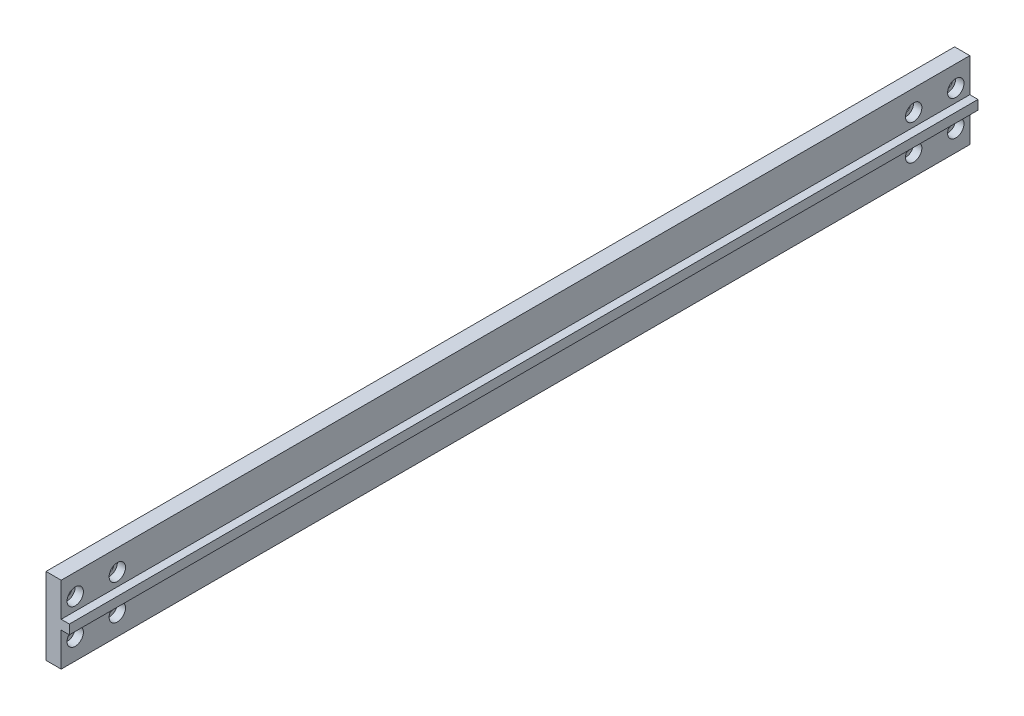
ISO-10303-21;
HEADER;
FILE_DESCRIPTION(('STEP AP214'),'2;1');
FILE_NAME('part.step','',(''),(''),'','','');
FILE_SCHEMA(('AUTOMOTIVE_DESIGN { 1 0 10303 214 1 1 1 1 }'));
ENDSEC;
DATA;
#1=APPLICATION_CONTEXT('core data for automotive mechanical design processes');
#2=APPLICATION_PROTOCOL_DEFINITION('international standard','automotive_design',2000,#1);
#3=PRODUCT_CONTEXT('',#1,'mechanical');
#4=PRODUCT('Part','Part','',(#3));
#5=PRODUCT_RELATED_PRODUCT_CATEGORY('part','',(#4));
#6=PRODUCT_DEFINITION_FORMATION('','',#4);
#7=PRODUCT_DEFINITION_CONTEXT('part definition',#1,'design');
#8=PRODUCT_DEFINITION('design','',#6,#7);
#9=PRODUCT_DEFINITION_SHAPE('','',#8);
#10=(LENGTH_UNIT() NAMED_UNIT(*) SI_UNIT(.MILLI.,.METRE.));
#11=(NAMED_UNIT(*) PLANE_ANGLE_UNIT() SI_UNIT($,.RADIAN.));
#12=(NAMED_UNIT(*) SI_UNIT($,.STERADIAN.) SOLID_ANGLE_UNIT());
#13=UNCERTAINTY_MEASURE_WITH_UNIT(LENGTH_MEASURE(1.E-05),#10,'distance_accuracy_value','');
#14=(GEOMETRIC_REPRESENTATION_CONTEXT(3) GLOBAL_UNCERTAINTY_ASSIGNED_CONTEXT((#13)) GLOBAL_UNIT_ASSIGNED_CONTEXT((#10,
#11,#12)) REPRESENTATION_CONTEXT('',''));
#15=CARTESIAN_POINT('',(0.,0.,0.));
#16=DIRECTION('',(0.,0.,1.));
#17=DIRECTION('',(1.,0.,0.));
#18=AXIS2_PLACEMENT_3D('',#15,#16,#17);
#19=CARTESIAN_POINT('',(0.,-16.475,388.6));
#20=DIRECTION('',(0.,1.,0.));
#21=DIRECTION('',(0.,0.,1.));
#22=AXIS2_PLACEMENT_3D('',#19,#20,#21);
#23=PLANE('',#22);
#24=DIRECTION('',(1.,0.,0.));
#25=VECTOR('',#24,1.);
#26=CARTESIAN_POINT('',(0.,-16.475,0.));
#27=LINE('',#26,#25);
#28=CARTESIAN_POINT('',(0.,-16.475,0.));
#29=VERTEX_POINT('',#28);
#30=CARTESIAN_POINT('',(6.5,-16.475,0.));
#31=VERTEX_POINT('',#30);
#32=EDGE_CURVE('E133',#29,#31,#27,.T.);
#33=ORIENTED_EDGE('',*,*,#32,.T.);
#34=DIRECTION('',(0.,0.,-1.));
#35=VECTOR('',#34,1.);
#36=CARTESIAN_POINT('',(6.5,-16.475,388.6));
#37=LINE('',#36,#35);
#38=CARTESIAN_POINT('',(6.5,-16.475,388.6));
#39=VERTEX_POINT('',#38);
#40=EDGE_CURVE('E11',#39,#31,#37,.T.);
#41=ORIENTED_EDGE('',*,*,#40,.F.);
#42=DIRECTION('',(1.,0.,0.));
#43=VECTOR('',#42,1.);
#44=CARTESIAN_POINT('',(0.,-16.475,388.6));
#45=LINE('',#44,#43);
#46=CARTESIAN_POINT('',(0.,-16.475,388.6));
#47=VERTEX_POINT('',#46);
#48=EDGE_CURVE('E148',#47,#39,#45,.T.);
#49=ORIENTED_EDGE('',*,*,#48,.F.);
#50=DIRECTION('',(0.,0.,-1.));
#51=VECTOR('',#50,1.);
#52=CARTESIAN_POINT('',(0.,-16.475,388.6));
#53=LINE('',#52,#51);
#54=EDGE_CURVE('E129',#47,#29,#53,.T.);
#55=ORIENTED_EDGE('',*,*,#54,.T.);
#56=EDGE_LOOP('',(#33,#41,#49,#55));
#57=FACE_BOUND('',#56,.T.);
#58=ADVANCED_FACE('F37',(#57),#23,.F.);
#59=CARTESIAN_POINT('',(6.5,-1.99999999999999,388.6));
#60=DIRECTION('',(-1.,0.,0.));
#61=DIRECTION('',(0.,-1.,0.));
#62=AXIS2_PLACEMENT_3D('',#59,#60,#61);
#63=PLANE('',#62);
#64=CARTESIAN_POINT('',(6.50000000000001,-7.5,382.6));
#65=DIRECTION('',(1.,0.,0.));
#66=DIRECTION('',(0.,0.,-1.));
#67=AXIS2_PLACEMENT_3D('',#64,#65,#66);
#68=CIRCLE('',#67,3.5);
#69=CARTESIAN_POINT('',(6.50000000000001,-7.5,379.1));
#70=VERTEX_POINT('',#69);
#71=EDGE_CURVE('E273',#70,#70,#68,.T.);
#72=ORIENTED_EDGE('',*,*,#71,.F.);
#73=EDGE_LOOP('',(#72));
#74=FACE_BOUND('',#73,.T.);
#75=CARTESIAN_POINT('',(6.50000000000001,-7.5,364.6));
#76=DIRECTION('',(1.,0.,0.));
#77=DIRECTION('',(0.,0.,-1.));
#78=AXIS2_PLACEMENT_3D('',#75,#76,#77);
#79=CIRCLE('',#78,3.5);
#80=CARTESIAN_POINT('',(6.50000000000001,-7.5,361.1));
#81=VERTEX_POINT('',#80);
#82=EDGE_CURVE('E261',#81,#81,#79,.T.);
#83=ORIENTED_EDGE('',*,*,#82,.F.);
#84=EDGE_LOOP('',(#83));
#85=FACE_BOUND('',#84,.T.);
#86=CARTESIAN_POINT('',(6.50000000000001,-7.5,24.));
#87=DIRECTION('',(1.,0.,0.));
#88=DIRECTION('',(0.,0.,-1.));
#89=AXIS2_PLACEMENT_3D('',#86,#87,#88);
#90=CIRCLE('',#89,3.5);
#91=CARTESIAN_POINT('',(6.50000000000001,-7.5,20.5));
#92=VERTEX_POINT('',#91);
#93=EDGE_CURVE('E213',#92,#92,#90,.T.);
#94=ORIENTED_EDGE('',*,*,#93,.F.);
#95=EDGE_LOOP('',(#94));
#96=FACE_BOUND('',#95,.T.);
#97=CARTESIAN_POINT('',(6.50000000000001,-7.5,6.00000000000001));
#98=DIRECTION('',(1.,0.,0.));
#99=DIRECTION('',(0.,0.,-1.));
#100=AXIS2_PLACEMENT_3D('',#97,#98,#99);
#101=CIRCLE('',#100,3.5);
#102=CARTESIAN_POINT('',(6.50000000000001,-7.5,2.50000000000001));
#103=VERTEX_POINT('',#102);
#104=EDGE_CURVE('E201',#103,#103,#101,.T.);
#105=ORIENTED_EDGE('',*,*,#104,.F.);
#106=EDGE_LOOP('',(#105));
#107=FACE_BOUND('',#106,.T.);
#108=DIRECTION('',(0.,1.,0.));
#109=VECTOR('',#108,1.);
#110=CARTESIAN_POINT('',(6.5,-1.99999999999999,0.));
#111=LINE('',#110,#109);
#112=CARTESIAN_POINT('',(6.5,-1.99999999999999,0.));
#113=VERTEX_POINT('',#112);
#114=EDGE_CURVE('E136',#31,#113,#111,.T.);
#115=ORIENTED_EDGE('',*,*,#114,.T.);
#116=DIRECTION('',(0.,0.,-1.));
#117=VECTOR('',#116,1.);
#118=CARTESIAN_POINT('',(6.5,-1.99999999999999,388.6));
#119=LINE('',#118,#117);
#120=CARTESIAN_POINT('',(6.5,-1.99999999999999,388.6));
#121=VERTEX_POINT('',#120);
#122=EDGE_CURVE('E45',#121,#113,#119,.T.);
#123=ORIENTED_EDGE('',*,*,#122,.F.);
#124=DIRECTION('',(0.,1.,0.));
#125=VECTOR('',#124,1.);
#126=CARTESIAN_POINT('',(6.5,-1.99999999999999,388.6));
#127=LINE('',#126,#125);
#128=EDGE_CURVE('E96',#39,#121,#127,.T.);
#129=ORIENTED_EDGE('',*,*,#128,.F.);
#130=ORIENTED_EDGE('',*,*,#40,.T.);
#131=EDGE_LOOP('',(#115,#123,#129,#130));
#132=FACE_BOUND('',#131,.T.);
#133=ADVANCED_FACE('F279',(#74,#85,#96,#107,#132),#63,.F.);
#134=CARTESIAN_POINT('',(10.,-1.99999999999999,388.6));
#135=DIRECTION('',(0.,1.,0.));
#136=DIRECTION('',(-1.,0.,0.));
#137=AXIS2_PLACEMENT_3D('',#134,#135,#136);
#138=PLANE('',#137);
#139=DIRECTION('',(1.,0.,0.));
#140=VECTOR('',#139,1.);
#141=CARTESIAN_POINT('',(10.,-1.99999999999999,0.));
#142=LINE('',#141,#140);
#143=CARTESIAN_POINT('',(10.,-1.99999999999999,0.));
#144=VERTEX_POINT('',#143);
#145=EDGE_CURVE('E139',#113,#144,#142,.T.);
#146=ORIENTED_EDGE('',*,*,#145,.T.);
#147=DIRECTION('',(0.,0.,-1.));
#148=VECTOR('',#147,1.);
#149=CARTESIAN_POINT('',(10.,-1.99999999999999,388.6));
#150=LINE('',#149,#148);
#151=CARTESIAN_POINT('',(10.,-1.99999999999999,388.6));
#152=VERTEX_POINT('',#151);
#153=EDGE_CURVE('E155',#152,#144,#150,.T.);
#154=ORIENTED_EDGE('',*,*,#153,.F.);
#155=DIRECTION('',(1.,0.,0.));
#156=VECTOR('',#155,1.);
#157=CARTESIAN_POINT('',(10.,-1.99999999999999,388.6));
#158=LINE('',#157,#156);
#159=EDGE_CURVE('E163',#121,#152,#158,.T.);
#160=ORIENTED_EDGE('',*,*,#159,.F.);
#161=ORIENTED_EDGE('',*,*,#122,.T.);
#162=EDGE_LOOP('',(#146,#154,#160,#161));
#163=FACE_BOUND('',#162,.T.);
#164=ADVANCED_FACE('F161',(#163),#138,.F.);
#165=CARTESIAN_POINT('',(10.,2.00000000000001,388.6));
#166=DIRECTION('',(-1.,0.,0.));
#167=DIRECTION('',(0.,0.,1.));
#168=AXIS2_PLACEMENT_3D('',#165,#166,#167);
#169=PLANE('',#168);
#170=DIRECTION('',(0.,1.,0.));
#171=VECTOR('',#170,1.);
#172=CARTESIAN_POINT('',(10.,2.00000000000001,0.));
#173=LINE('',#172,#171);
#174=CARTESIAN_POINT('',(10.,2.00000000000001,0.));
#175=VERTEX_POINT('',#174);
#176=EDGE_CURVE('E141',#144,#175,#173,.T.);
#177=ORIENTED_EDGE('',*,*,#176,.T.);
#178=DIRECTION('',(0.,0.,-1.));
#179=VECTOR('',#178,1.);
#180=CARTESIAN_POINT('',(10.,2.00000000000001,388.6));
#181=LINE('',#180,#179);
#182=CARTESIAN_POINT('',(10.,2.00000000000001,388.6));
#183=VERTEX_POINT('',#182);
#184=EDGE_CURVE('E152',#183,#175,#181,.T.);
#185=ORIENTED_EDGE('',*,*,#184,.F.);
#186=DIRECTION('',(0.,1.,0.));
#187=VECTOR('',#186,1.);
#188=CARTESIAN_POINT('',(10.,2.00000000000001,388.6));
#189=LINE('',#188,#187);
#190=EDGE_CURVE('E175',#152,#183,#189,.T.);
#191=ORIENTED_EDGE('',*,*,#190,.F.);
#192=ORIENTED_EDGE('',*,*,#153,.T.);
#193=EDGE_LOOP('',(#177,#185,#191,#192));
#194=FACE_BOUND('',#193,.T.);
#195=ADVANCED_FACE('F171',(#194),#169,.F.);
#196=CARTESIAN_POINT('',(6.5,2.00000000000001,388.6));
#197=DIRECTION('',(0.,-1.,0.));
#198=DIRECTION('',(0.,0.,-1.));
#199=AXIS2_PLACEMENT_3D('',#196,#197,#198);
#200=PLANE('',#199);
#201=DIRECTION('',(-1.,0.,0.));
#202=VECTOR('',#201,1.);
#203=CARTESIAN_POINT('',(6.5,2.00000000000001,0.));
#204=LINE('',#203,#202);
#205=CARTESIAN_POINT('',(6.5,2.00000000000001,0.));
#206=VERTEX_POINT('',#205);
#207=EDGE_CURVE('E143',#175,#206,#204,.T.);
#208=ORIENTED_EDGE('',*,*,#207,.T.);
#209=DIRECTION('',(0.,0.,-1.));
#210=VECTOR('',#209,1.);
#211=CARTESIAN_POINT('',(6.5,2.00000000000001,388.6));
#212=LINE('',#211,#210);
#213=CARTESIAN_POINT('',(6.5,2.00000000000001,388.6));
#214=VERTEX_POINT('',#213);
#215=EDGE_CURVE('E124',#214,#206,#212,.T.);
#216=ORIENTED_EDGE('',*,*,#215,.F.);
#217=DIRECTION('',(-1.,0.,0.));
#218=VECTOR('',#217,1.);
#219=CARTESIAN_POINT('',(6.5,2.00000000000001,388.6));
#220=LINE('',#219,#218);
#221=EDGE_CURVE('E115',#183,#214,#220,.T.);
#222=ORIENTED_EDGE('',*,*,#221,.F.);
#223=ORIENTED_EDGE('',*,*,#184,.T.);
#224=EDGE_LOOP('',(#208,#216,#222,#223));
#225=FACE_BOUND('',#224,.T.);
#226=ADVANCED_FACE('F174',(#225),#200,.F.);
#227=CARTESIAN_POINT('',(6.49999999999999,16.475,388.6));
#228=DIRECTION('',(-1.,0.,0.));
#229=DIRECTION('',(0.,-1.,0.));
#230=AXIS2_PLACEMENT_3D('',#227,#228,#229);
#231=PLANE('',#230);
#232=CARTESIAN_POINT('',(6.5,7.5,364.6));
#233=DIRECTION('',(1.,0.,0.));
#234=DIRECTION('',(0.,0.,-1.));
#235=AXIS2_PLACEMENT_3D('',#232,#233,#234);
#236=CIRCLE('',#235,3.5);
#237=CARTESIAN_POINT('',(6.5,7.5,361.1));
#238=VERTEX_POINT('',#237);
#239=EDGE_CURVE('E249',#238,#238,#236,.T.);
#240=ORIENTED_EDGE('',*,*,#239,.F.);
#241=EDGE_LOOP('',(#240));
#242=FACE_BOUND('',#241,.T.);
#243=CARTESIAN_POINT('',(6.5,7.5,382.6));
#244=DIRECTION('',(1.,0.,0.));
#245=DIRECTION('',(0.,0.,-1.));
#246=AXIS2_PLACEMENT_3D('',#243,#244,#245);
#247=CIRCLE('',#246,3.5);
#248=CARTESIAN_POINT('',(6.5,7.5,379.1));
#249=VERTEX_POINT('',#248);
#250=EDGE_CURVE('E237',#249,#249,#247,.T.);
#251=ORIENTED_EDGE('',*,*,#250,.F.);
#252=EDGE_LOOP('',(#251));
#253=FACE_BOUND('',#252,.T.);
#254=CARTESIAN_POINT('',(6.5,7.5,24.));
#255=DIRECTION('',(1.,0.,0.));
#256=DIRECTION('',(0.,0.,-1.));
#257=AXIS2_PLACEMENT_3D('',#254,#255,#256);
#258=CIRCLE('',#257,3.5);
#259=CARTESIAN_POINT('',(6.5,7.5,20.5));
#260=VERTEX_POINT('',#259);
#261=EDGE_CURVE('E225',#260,#260,#258,.T.);
#262=ORIENTED_EDGE('',*,*,#261,.F.);
#263=EDGE_LOOP('',(#262));
#264=FACE_BOUND('',#263,.T.);
#265=CARTESIAN_POINT('',(6.5,7.5,6.));
#266=DIRECTION('',(1.,0.,0.));
#267=DIRECTION('',(0.,0.,-1.));
#268=AXIS2_PLACEMENT_3D('',#265,#266,#267);
#269=CIRCLE('',#268,3.5);
#270=CARTESIAN_POINT('',(6.5,7.5,2.5));
#271=VERTEX_POINT('',#270);
#272=EDGE_CURVE('E189',#271,#271,#269,.T.);
#273=ORIENTED_EDGE('',*,*,#272,.F.);
#274=EDGE_LOOP('',(#273));
#275=FACE_BOUND('',#274,.T.);
#276=DIRECTION('',(0.,1.,0.));
#277=VECTOR('',#276,1.);
#278=CARTESIAN_POINT('',(6.49999999999999,16.475,0.));
#279=LINE('',#278,#277);
#280=CARTESIAN_POINT('',(6.49999999999999,16.475,0.));
#281=VERTEX_POINT('',#280);
#282=EDGE_CURVE('E123',#206,#281,#279,.T.);
#283=ORIENTED_EDGE('',*,*,#282,.T.);
#284=DIRECTION('',(0.,0.,-1.));
#285=VECTOR('',#284,1.);
#286=CARTESIAN_POINT('',(6.49999999999999,16.475,388.6));
#287=LINE('',#286,#285);
#288=CARTESIAN_POINT('',(6.49999999999999,16.475,388.6));
#289=VERTEX_POINT('',#288);
#290=EDGE_CURVE('E120',#289,#281,#287,.T.);
#291=ORIENTED_EDGE('',*,*,#290,.F.);
#292=DIRECTION('',(0.,1.,0.));
#293=VECTOR('',#292,1.);
#294=CARTESIAN_POINT('',(6.49999999999999,16.475,388.6));
#295=LINE('',#294,#293);
#296=EDGE_CURVE('E109',#214,#289,#295,.T.);
#297=ORIENTED_EDGE('',*,*,#296,.F.);
#298=ORIENTED_EDGE('',*,*,#215,.T.);
#299=EDGE_LOOP('',(#283,#291,#297,#298));
#300=FACE_BOUND('',#299,.T.);
#301=ADVANCED_FACE('F121',(#242,#253,#264,#275,#300),#231,.F.);
#302=CARTESIAN_POINT('',(0.,16.475,388.6));
#303=DIRECTION('',(0.,-1.,0.));
#304=DIRECTION('',(1.,0.,0.));
#305=AXIS2_PLACEMENT_3D('',#302,#303,#304);
#306=PLANE('',#305);
#307=DIRECTION('',(-1.,0.,0.));
#308=VECTOR('',#307,1.);
#309=CARTESIAN_POINT('',(0.,16.475,0.));
#310=LINE('',#309,#308);
#311=CARTESIAN_POINT('',(0.,16.475,0.));
#312=VERTEX_POINT('',#311);
#313=EDGE_CURVE('E82',#281,#312,#310,.T.);
#314=ORIENTED_EDGE('',*,*,#313,.T.);
#315=DIRECTION('',(0.,0.,-1.));
#316=VECTOR('',#315,1.);
#317=CARTESIAN_POINT('',(0.,16.475,388.6));
#318=LINE('',#317,#316);
#319=CARTESIAN_POINT('',(0.,16.475,388.6));
#320=VERTEX_POINT('',#319);
#321=EDGE_CURVE('E125',#320,#312,#318,.T.);
#322=ORIENTED_EDGE('',*,*,#321,.F.);
#323=DIRECTION('',(-1.,0.,0.));
#324=VECTOR('',#323,1.);
#325=CARTESIAN_POINT('',(0.,16.475,388.6));
#326=LINE('',#325,#324);
#327=EDGE_CURVE('E113',#289,#320,#326,.T.);
#328=ORIENTED_EDGE('',*,*,#327,.F.);
#329=ORIENTED_EDGE('',*,*,#290,.T.);
#330=EDGE_LOOP('',(#314,#322,#328,#329));
#331=FACE_BOUND('',#330,.T.);
#332=ADVANCED_FACE('F127',(#331),#306,.F.);
#333=CARTESIAN_POINT('',(0.,16.475,388.6));
#334=DIRECTION('',(1.,0.,0.));
#335=DIRECTION('',(0.,1.,0.));
#336=AXIS2_PLACEMENT_3D('',#333,#334,#335);
#337=PLANE('',#336);
#338=CARTESIAN_POINT('',(0.,-7.5,382.6));
#339=DIRECTION('',(1.,0.,0.));
#340=DIRECTION('',(0.,0.,-1.));
#341=AXIS2_PLACEMENT_3D('',#338,#339,#340);
#342=CIRCLE('',#341,2.);
#343=CARTESIAN_POINT('',(0.,-7.5,380.6));
#344=VERTEX_POINT('',#343);
#345=EDGE_CURVE('E264',#344,#344,#342,.T.);
#346=ORIENTED_EDGE('',*,*,#345,.T.);
#347=EDGE_LOOP('',(#346));
#348=FACE_BOUND('',#347,.T.);
#349=CARTESIAN_POINT('',(0.,-7.5,364.6));
#350=DIRECTION('',(1.,0.,0.));
#351=DIRECTION('',(0.,0.,-1.));
#352=AXIS2_PLACEMENT_3D('',#349,#350,#351);
#353=CIRCLE('',#352,2.);
#354=CARTESIAN_POINT('',(0.,-7.5,362.6));
#355=VERTEX_POINT('',#354);
#356=EDGE_CURVE('E252',#355,#355,#353,.T.);
#357=ORIENTED_EDGE('',*,*,#356,.T.);
#358=EDGE_LOOP('',(#357));
#359=FACE_BOUND('',#358,.T.);
#360=CARTESIAN_POINT('',(0.,7.5,364.6));
#361=DIRECTION('',(1.,0.,0.));
#362=DIRECTION('',(0.,0.,-1.));
#363=AXIS2_PLACEMENT_3D('',#360,#361,#362);
#364=CIRCLE('',#363,2.);
#365=CARTESIAN_POINT('',(0.,7.5,362.6));
#366=VERTEX_POINT('',#365);
#367=EDGE_CURVE('E240',#366,#366,#364,.T.);
#368=ORIENTED_EDGE('',*,*,#367,.T.);
#369=EDGE_LOOP('',(#368));
#370=FACE_BOUND('',#369,.T.);
#371=CARTESIAN_POINT('',(0.,7.5,382.6));
#372=DIRECTION('',(1.,0.,0.));
#373=DIRECTION('',(0.,0.,-1.));
#374=AXIS2_PLACEMENT_3D('',#371,#372,#373);
#375=CIRCLE('',#374,2.);
#376=CARTESIAN_POINT('',(0.,7.5,380.6));
#377=VERTEX_POINT('',#376);
#378=EDGE_CURVE('E228',#377,#377,#375,.T.);
#379=ORIENTED_EDGE('',*,*,#378,.T.);
#380=EDGE_LOOP('',(#379));
#381=FACE_BOUND('',#380,.T.);
#382=CARTESIAN_POINT('',(0.,7.5,24.));
#383=DIRECTION('',(1.,0.,0.));
#384=DIRECTION('',(0.,0.,-1.));
#385=AXIS2_PLACEMENT_3D('',#382,#383,#384);
#386=CIRCLE('',#385,2.);
#387=CARTESIAN_POINT('',(0.,7.5,22.));
#388=VERTEX_POINT('',#387);
#389=EDGE_CURVE('E216',#388,#388,#386,.T.);
#390=ORIENTED_EDGE('',*,*,#389,.T.);
#391=EDGE_LOOP('',(#390));
#392=FACE_BOUND('',#391,.T.);
#393=CARTESIAN_POINT('',(0.,-7.5,24.));
#394=DIRECTION('',(1.,0.,0.));
#395=DIRECTION('',(0.,0.,-1.));
#396=AXIS2_PLACEMENT_3D('',#393,#394,#395);
#397=CIRCLE('',#396,2.);
#398=CARTESIAN_POINT('',(0.,-7.5,22.));
#399=VERTEX_POINT('',#398);
#400=EDGE_CURVE('E204',#399,#399,#397,.T.);
#401=ORIENTED_EDGE('',*,*,#400,.T.);
#402=EDGE_LOOP('',(#401));
#403=FACE_BOUND('',#402,.T.);
#404=CARTESIAN_POINT('',(0.,-7.5,6.00000000000001));
#405=DIRECTION('',(1.,0.,0.));
#406=DIRECTION('',(0.,0.,-1.));
#407=AXIS2_PLACEMENT_3D('',#404,#405,#406);
#408=CIRCLE('',#407,2.);
#409=CARTESIAN_POINT('',(0.,-7.5,4.00000000000001));
#410=VERTEX_POINT('',#409);
#411=EDGE_CURVE('E192',#410,#410,#408,.T.);
#412=ORIENTED_EDGE('',*,*,#411,.T.);
#413=EDGE_LOOP('',(#412));
#414=FACE_BOUND('',#413,.T.);
#415=CARTESIAN_POINT('',(0.,7.5,6.));
#416=DIRECTION('',(1.,0.,0.));
#417=DIRECTION('',(0.,0.,-1.));
#418=AXIS2_PLACEMENT_3D('',#415,#416,#417);
#419=CIRCLE('',#418,2.);
#420=CARTESIAN_POINT('',(0.,7.5,4.));
#421=VERTEX_POINT('',#420);
#422=EDGE_CURVE('E137',#421,#421,#419,.T.);
#423=ORIENTED_EDGE('',*,*,#422,.T.);
#424=EDGE_LOOP('',(#423));
#425=FACE_BOUND('',#424,.T.);
#426=DIRECTION('',(0.,-1.,0.));
#427=VECTOR('',#426,1.);
#428=CARTESIAN_POINT('',(0.,16.475,0.));
#429=LINE('',#428,#427);
#430=EDGE_CURVE('E88',#312,#29,#429,.T.);
#431=ORIENTED_EDGE('',*,*,#430,.T.);
#432=ORIENTED_EDGE('',*,*,#54,.F.);
#433=DIRECTION('',(0.,-1.,0.));
#434=VECTOR('',#433,1.);
#435=CARTESIAN_POINT('',(0.,16.475,388.6));
#436=LINE('',#435,#434);
#437=EDGE_CURVE('E53',#320,#47,#436,.T.);
#438=ORIENTED_EDGE('',*,*,#437,.F.);
#439=ORIENTED_EDGE('',*,*,#321,.T.);
#440=EDGE_LOOP('',(#431,#432,#438,#439));
#441=FACE_BOUND('',#440,.T.);
#442=ADVANCED_FACE('F290',(#348,#359,#370,#381,#392,#403,#414,#425,#441),#337,.F.);
#443=CARTESIAN_POINT('',(0.,0.,388.6));
#444=DIRECTION('',(0.,0.,-1.));
#445=DIRECTION('',(-1.,0.,0.));
#446=AXIS2_PLACEMENT_3D('',#443,#444,#445);
#447=PLANE('',#446);
#448=ORIENTED_EDGE('',*,*,#48,.T.);
#449=ORIENTED_EDGE('',*,*,#128,.T.);
#450=ORIENTED_EDGE('',*,*,#159,.T.);
#451=ORIENTED_EDGE('',*,*,#190,.T.);
#452=ORIENTED_EDGE('',*,*,#221,.T.);
#453=ORIENTED_EDGE('',*,*,#296,.T.);
#454=ORIENTED_EDGE('',*,*,#327,.T.);
#455=ORIENTED_EDGE('',*,*,#437,.T.);
#456=EDGE_LOOP('',(#448,#449,#450,#451,#452,#453,#454,#455));
#457=FACE_BOUND('',#456,.T.);
#458=ADVANCED_FACE('F111',(#457),#447,.F.);
#459=CARTESIAN_POINT('',(0.,0.,0.));
#460=DIRECTION('',(0.,0.,-1.));
#461=DIRECTION('',(-1.,0.,0.));
#462=AXIS2_PLACEMENT_3D('',#459,#460,#461);
#463=PLANE('',#462);
#464=ORIENTED_EDGE('',*,*,#32,.F.);
#465=ORIENTED_EDGE('',*,*,#430,.F.);
#466=ORIENTED_EDGE('',*,*,#313,.F.);
#467=ORIENTED_EDGE('',*,*,#282,.F.);
#468=ORIENTED_EDGE('',*,*,#207,.F.);
#469=ORIENTED_EDGE('',*,*,#176,.F.);
#470=ORIENTED_EDGE('',*,*,#145,.F.);
#471=ORIENTED_EDGE('',*,*,#114,.F.);
#472=EDGE_LOOP('',(#464,#465,#466,#467,#468,#469,#470,#471));
#473=FACE_BOUND('',#472,.T.);
#474=ADVANCED_FACE('F167',(#473),#463,.T.);
#475=CARTESIAN_POINT('',(6.5,7.5,6.));
#476=DIRECTION('',(1.,0.,0.));
#477=DIRECTION('',(0.,0.,-1.));
#478=AXIS2_PLACEMENT_3D('',#475,#476,#477);
#479=CYLINDRICAL_SURFACE('',#478,2.);
#480=ORIENTED_EDGE('',*,*,#422,.F.);
#481=EDGE_LOOP('',(#480));
#482=FACE_BOUND('',#481,.T.);
#483=CARTESIAN_POINT('',(3.,7.5,6.));
#484=DIRECTION('',(1.,0.,0.));
#485=DIRECTION('',(0.,0.,-1.));
#486=AXIS2_PLACEMENT_3D('',#483,#484,#485);
#487=CIRCLE('',#486,2.);
#488=CARTESIAN_POINT('',(3.,7.5,4.));
#489=VERTEX_POINT('',#488);
#490=EDGE_CURVE('E183',#489,#489,#487,.T.);
#491=ORIENTED_EDGE('',*,*,#490,.T.);
#492=EDGE_LOOP('',(#491));
#493=FACE_BOUND('',#492,.T.);
#494=ADVANCED_FACE('F353',(#482,#493),#479,.F.);
#495=CARTESIAN_POINT('',(3.,9.5,6.));
#496=DIRECTION('',(-1.,0.,0.));
#497=DIRECTION('',(0.,0.,1.));
#498=AXIS2_PLACEMENT_3D('',#495,#496,#497);
#499=PLANE('',#498);
#500=ORIENTED_EDGE('',*,*,#490,.F.);
#501=EDGE_LOOP('',(#500));
#502=FACE_BOUND('',#501,.T.);
#503=CARTESIAN_POINT('',(3.,7.5,6.));
#504=DIRECTION('',(1.,0.,0.));
#505=DIRECTION('',(0.,0.,-1.));
#506=AXIS2_PLACEMENT_3D('',#503,#504,#505);
#507=CIRCLE('',#506,3.5);
#508=CARTESIAN_POINT('',(3.,7.5,2.5));
#509=VERTEX_POINT('',#508);
#510=EDGE_CURVE('E186',#509,#509,#507,.T.);
#511=ORIENTED_EDGE('',*,*,#510,.T.);
#512=EDGE_LOOP('',(#511));
#513=FACE_BOUND('',#512,.T.);
#514=ADVANCED_FACE('F362',(#502,#513),#499,.F.);
#515=CARTESIAN_POINT('',(6.5,7.5,6.));
#516=DIRECTION('',(1.,0.,0.));
#517=DIRECTION('',(0.,0.,-1.));
#518=AXIS2_PLACEMENT_3D('',#515,#516,#517);
#519=CYLINDRICAL_SURFACE('',#518,3.5);
#520=ORIENTED_EDGE('',*,*,#510,.F.);
#521=EDGE_LOOP('',(#520));
#522=FACE_BOUND('',#521,.T.);
#523=ORIENTED_EDGE('',*,*,#272,.T.);
#524=EDGE_LOOP('',(#523));
#525=FACE_BOUND('',#524,.T.);
#526=ADVANCED_FACE('F369',(#522,#525),#519,.F.);
#527=CARTESIAN_POINT('',(6.50000000000001,-7.5,6.00000000000001));
#528=DIRECTION('',(1.,0.,0.));
#529=DIRECTION('',(0.,0.,-1.));
#530=AXIS2_PLACEMENT_3D('',#527,#528,#529);
#531=CYLINDRICAL_SURFACE('',#530,2.);
#532=ORIENTED_EDGE('',*,*,#411,.F.);
#533=EDGE_LOOP('',(#532));
#534=FACE_BOUND('',#533,.T.);
#535=CARTESIAN_POINT('',(3.00000000000001,-7.5,6.00000000000001));
#536=DIRECTION('',(1.,0.,0.));
#537=DIRECTION('',(0.,0.,-1.));
#538=AXIS2_PLACEMENT_3D('',#535,#536,#537);
#539=CIRCLE('',#538,2.);
#540=CARTESIAN_POINT('',(3.00000000000001,-7.5,4.00000000000001));
#541=VERTEX_POINT('',#540);
#542=EDGE_CURVE('E195',#541,#541,#539,.T.);
#543=ORIENTED_EDGE('',*,*,#542,.T.);
#544=EDGE_LOOP('',(#543));
#545=FACE_BOUND('',#544,.T.);
#546=ADVANCED_FACE('F377',(#534,#545),#531,.F.);
#547=CARTESIAN_POINT('',(3.00000000000001,-5.5,6.00000000000001));
#548=DIRECTION('',(-1.,0.,0.));
#549=DIRECTION('',(0.,0.,1.));
#550=AXIS2_PLACEMENT_3D('',#547,#548,#549);
#551=PLANE('',#550);
#552=ORIENTED_EDGE('',*,*,#542,.F.);
#553=EDGE_LOOP('',(#552));
#554=FACE_BOUND('',#553,.T.);
#555=CARTESIAN_POINT('',(3.00000000000001,-7.5,6.00000000000001));
#556=DIRECTION('',(1.,0.,0.));
#557=DIRECTION('',(0.,0.,-1.));
#558=AXIS2_PLACEMENT_3D('',#555,#556,#557);
#559=CIRCLE('',#558,3.5);
#560=CARTESIAN_POINT('',(3.00000000000001,-7.5,2.50000000000001));
#561=VERTEX_POINT('',#560);
#562=EDGE_CURVE('E198',#561,#561,#559,.T.);
#563=ORIENTED_EDGE('',*,*,#562,.T.);
#564=EDGE_LOOP('',(#563));
#565=FACE_BOUND('',#564,.T.);
#566=ADVANCED_FACE('F385',(#554,#565),#551,.F.);
#567=CARTESIAN_POINT('',(6.50000000000001,-7.5,6.00000000000001));
#568=DIRECTION('',(1.,0.,0.));
#569=DIRECTION('',(0.,0.,-1.));
#570=AXIS2_PLACEMENT_3D('',#567,#568,#569);
#571=CYLINDRICAL_SURFACE('',#570,3.5);
#572=ORIENTED_EDGE('',*,*,#562,.F.);
#573=EDGE_LOOP('',(#572));
#574=FACE_BOUND('',#573,.T.);
#575=ORIENTED_EDGE('',*,*,#104,.T.);
#576=EDGE_LOOP('',(#575));
#577=FACE_BOUND('',#576,.T.);
#578=ADVANCED_FACE('F393',(#574,#577),#571,.F.);
#579=CARTESIAN_POINT('',(6.50000000000001,-7.5,24.));
#580=DIRECTION('',(1.,0.,0.));
#581=DIRECTION('',(0.,0.,-1.));
#582=AXIS2_PLACEMENT_3D('',#579,#580,#581);
#583=CYLINDRICAL_SURFACE('',#582,2.);
#584=ORIENTED_EDGE('',*,*,#400,.F.);
#585=EDGE_LOOP('',(#584));
#586=FACE_BOUND('',#585,.T.);
#587=CARTESIAN_POINT('',(3.00000000000001,-7.5,24.));
#588=DIRECTION('',(1.,0.,0.));
#589=DIRECTION('',(0.,0.,-1.));
#590=AXIS2_PLACEMENT_3D('',#587,#588,#589);
#591=CIRCLE('',#590,2.);
#592=CARTESIAN_POINT('',(3.00000000000001,-7.5,22.));
#593=VERTEX_POINT('',#592);
#594=EDGE_CURVE('E207',#593,#593,#591,.T.);
#595=ORIENTED_EDGE('',*,*,#594,.T.);
#596=EDGE_LOOP('',(#595));
#597=FACE_BOUND('',#596,.T.);
#598=ADVANCED_FACE('F401',(#586,#597),#583,.F.);
#599=CARTESIAN_POINT('',(3.00000000000001,-5.5,24.));
#600=DIRECTION('',(-1.,0.,0.));
#601=DIRECTION('',(0.,0.,1.));
#602=AXIS2_PLACEMENT_3D('',#599,#600,#601);
#603=PLANE('',#602);
#604=ORIENTED_EDGE('',*,*,#594,.F.);
#605=EDGE_LOOP('',(#604));
#606=FACE_BOUND('',#605,.T.);
#607=CARTESIAN_POINT('',(3.00000000000001,-7.5,24.));
#608=DIRECTION('',(1.,0.,0.));
#609=DIRECTION('',(0.,0.,-1.));
#610=AXIS2_PLACEMENT_3D('',#607,#608,#609);
#611=CIRCLE('',#610,3.5);
#612=CARTESIAN_POINT('',(3.00000000000001,-7.5,20.5));
#613=VERTEX_POINT('',#612);
#614=EDGE_CURVE('E210',#613,#613,#611,.T.);
#615=ORIENTED_EDGE('',*,*,#614,.T.);
#616=EDGE_LOOP('',(#615));
#617=FACE_BOUND('',#616,.T.);
#618=ADVANCED_FACE('F409',(#606,#617),#603,.F.);
#619=CARTESIAN_POINT('',(6.50000000000001,-7.5,24.));
#620=DIRECTION('',(1.,0.,0.));
#621=DIRECTION('',(0.,0.,-1.));
#622=AXIS2_PLACEMENT_3D('',#619,#620,#621);
#623=CYLINDRICAL_SURFACE('',#622,3.5);
#624=ORIENTED_EDGE('',*,*,#614,.F.);
#625=EDGE_LOOP('',(#624));
#626=FACE_BOUND('',#625,.T.);
#627=ORIENTED_EDGE('',*,*,#93,.T.);
#628=EDGE_LOOP('',(#627));
#629=FACE_BOUND('',#628,.T.);
#630=ADVANCED_FACE('F417',(#626,#629),#623,.F.);
#631=CARTESIAN_POINT('',(6.5,7.5,24.));
#632=DIRECTION('',(1.,0.,0.));
#633=DIRECTION('',(0.,0.,-1.));
#634=AXIS2_PLACEMENT_3D('',#631,#632,#633);
#635=CYLINDRICAL_SURFACE('',#634,2.);
#636=ORIENTED_EDGE('',*,*,#389,.F.);
#637=EDGE_LOOP('',(#636));
#638=FACE_BOUND('',#637,.T.);
#639=CARTESIAN_POINT('',(3.,7.5,24.));
#640=DIRECTION('',(1.,0.,0.));
#641=DIRECTION('',(0.,0.,-1.));
#642=AXIS2_PLACEMENT_3D('',#639,#640,#641);
#643=CIRCLE('',#642,2.);
#644=CARTESIAN_POINT('',(3.,7.5,22.));
#645=VERTEX_POINT('',#644);
#646=EDGE_CURVE('E219',#645,#645,#643,.T.);
#647=ORIENTED_EDGE('',*,*,#646,.T.);
#648=EDGE_LOOP('',(#647));
#649=FACE_BOUND('',#648,.T.);
#650=ADVANCED_FACE('F425',(#638,#649),#635,.F.);
#651=CARTESIAN_POINT('',(3.,9.5,24.));
#652=DIRECTION('',(-1.,0.,0.));
#653=DIRECTION('',(0.,0.,1.));
#654=AXIS2_PLACEMENT_3D('',#651,#652,#653);
#655=PLANE('',#654);
#656=ORIENTED_EDGE('',*,*,#646,.F.);
#657=EDGE_LOOP('',(#656));
#658=FACE_BOUND('',#657,.T.);
#659=CARTESIAN_POINT('',(3.,7.5,24.));
#660=DIRECTION('',(1.,0.,0.));
#661=DIRECTION('',(0.,0.,-1.));
#662=AXIS2_PLACEMENT_3D('',#659,#660,#661);
#663=CIRCLE('',#662,3.5);
#664=CARTESIAN_POINT('',(3.,7.5,20.5));
#665=VERTEX_POINT('',#664);
#666=EDGE_CURVE('E222',#665,#665,#663,.T.);
#667=ORIENTED_EDGE('',*,*,#666,.T.);
#668=EDGE_LOOP('',(#667));
#669=FACE_BOUND('',#668,.T.);
#670=ADVANCED_FACE('F433',(#658,#669),#655,.F.);
#671=CARTESIAN_POINT('',(6.5,7.5,24.));
#672=DIRECTION('',(1.,0.,0.));
#673=DIRECTION('',(0.,0.,-1.));
#674=AXIS2_PLACEMENT_3D('',#671,#672,#673);
#675=CYLINDRICAL_SURFACE('',#674,3.5);
#676=ORIENTED_EDGE('',*,*,#666,.F.);
#677=EDGE_LOOP('',(#676));
#678=FACE_BOUND('',#677,.T.);
#679=ORIENTED_EDGE('',*,*,#261,.T.);
#680=EDGE_LOOP('',(#679));
#681=FACE_BOUND('',#680,.T.);
#682=ADVANCED_FACE('F441',(#678,#681),#675,.F.);
#683=CARTESIAN_POINT('',(6.5,7.5,382.6));
#684=DIRECTION('',(1.,0.,0.));
#685=DIRECTION('',(0.,0.,-1.));
#686=AXIS2_PLACEMENT_3D('',#683,#684,#685);
#687=CYLINDRICAL_SURFACE('',#686,2.);
#688=ORIENTED_EDGE('',*,*,#378,.F.);
#689=EDGE_LOOP('',(#688));
#690=FACE_BOUND('',#689,.T.);
#691=CARTESIAN_POINT('',(3.,7.5,382.6));
#692=DIRECTION('',(1.,0.,0.));
#693=DIRECTION('',(0.,0.,-1.));
#694=AXIS2_PLACEMENT_3D('',#691,#692,#693);
#695=CIRCLE('',#694,2.);
#696=CARTESIAN_POINT('',(3.,7.5,380.6));
#697=VERTEX_POINT('',#696);
#698=EDGE_CURVE('E231',#697,#697,#695,.T.);
#699=ORIENTED_EDGE('',*,*,#698,.T.);
#700=EDGE_LOOP('',(#699));
#701=FACE_BOUND('',#700,.T.);
#702=ADVANCED_FACE('F449',(#690,#701),#687,.F.);
#703=CARTESIAN_POINT('',(3.,9.5,382.6));
#704=DIRECTION('',(-1.,0.,0.));
#705=DIRECTION('',(0.,0.,1.));
#706=AXIS2_PLACEMENT_3D('',#703,#704,#705);
#707=PLANE('',#706);
#708=ORIENTED_EDGE('',*,*,#698,.F.);
#709=EDGE_LOOP('',(#708));
#710=FACE_BOUND('',#709,.T.);
#711=CARTESIAN_POINT('',(3.,7.5,382.6));
#712=DIRECTION('',(1.,0.,0.));
#713=DIRECTION('',(0.,0.,-1.));
#714=AXIS2_PLACEMENT_3D('',#711,#712,#713);
#715=CIRCLE('',#714,3.5);
#716=CARTESIAN_POINT('',(3.,7.5,379.1));
#717=VERTEX_POINT('',#716);
#718=EDGE_CURVE('E234',#717,#717,#715,.T.);
#719=ORIENTED_EDGE('',*,*,#718,.T.);
#720=EDGE_LOOP('',(#719));
#721=FACE_BOUND('',#720,.T.);
#722=ADVANCED_FACE('F457',(#710,#721),#707,.F.);
#723=CARTESIAN_POINT('',(6.5,7.5,382.6));
#724=DIRECTION('',(1.,0.,0.));
#725=DIRECTION('',(0.,0.,-1.));
#726=AXIS2_PLACEMENT_3D('',#723,#724,#725);
#727=CYLINDRICAL_SURFACE('',#726,3.5);
#728=ORIENTED_EDGE('',*,*,#718,.F.);
#729=EDGE_LOOP('',(#728));
#730=FACE_BOUND('',#729,.T.);
#731=ORIENTED_EDGE('',*,*,#250,.T.);
#732=EDGE_LOOP('',(#731));
#733=FACE_BOUND('',#732,.T.);
#734=ADVANCED_FACE('F465',(#730,#733),#727,.F.);
#735=CARTESIAN_POINT('',(6.5,7.5,364.6));
#736=DIRECTION('',(1.,0.,0.));
#737=DIRECTION('',(0.,0.,-1.));
#738=AXIS2_PLACEMENT_3D('',#735,#736,#737);
#739=CYLINDRICAL_SURFACE('',#738,2.);
#740=ORIENTED_EDGE('',*,*,#367,.F.);
#741=EDGE_LOOP('',(#740));
#742=FACE_BOUND('',#741,.T.);
#743=CARTESIAN_POINT('',(3.,7.5,364.6));
#744=DIRECTION('',(1.,0.,0.));
#745=DIRECTION('',(0.,0.,-1.));
#746=AXIS2_PLACEMENT_3D('',#743,#744,#745);
#747=CIRCLE('',#746,2.);
#748=CARTESIAN_POINT('',(3.,7.5,362.6));
#749=VERTEX_POINT('',#748);
#750=EDGE_CURVE('E243',#749,#749,#747,.T.);
#751=ORIENTED_EDGE('',*,*,#750,.T.);
#752=EDGE_LOOP('',(#751));
#753=FACE_BOUND('',#752,.T.);
#754=ADVANCED_FACE('F473',(#742,#753),#739,.F.);
#755=CARTESIAN_POINT('',(3.,9.5,364.6));
#756=DIRECTION('',(-1.,0.,0.));
#757=DIRECTION('',(0.,0.,1.));
#758=AXIS2_PLACEMENT_3D('',#755,#756,#757);
#759=PLANE('',#758);
#760=ORIENTED_EDGE('',*,*,#750,.F.);
#761=EDGE_LOOP('',(#760));
#762=FACE_BOUND('',#761,.T.);
#763=CARTESIAN_POINT('',(3.,7.5,364.6));
#764=DIRECTION('',(1.,0.,0.));
#765=DIRECTION('',(0.,0.,-1.));
#766=AXIS2_PLACEMENT_3D('',#763,#764,#765);
#767=CIRCLE('',#766,3.5);
#768=CARTESIAN_POINT('',(3.,7.5,361.1));
#769=VERTEX_POINT('',#768);
#770=EDGE_CURVE('E246',#769,#769,#767,.T.);
#771=ORIENTED_EDGE('',*,*,#770,.T.);
#772=EDGE_LOOP('',(#771));
#773=FACE_BOUND('',#772,.T.);
#774=ADVANCED_FACE('F481',(#762,#773),#759,.F.);
#775=CARTESIAN_POINT('',(6.5,7.5,364.6));
#776=DIRECTION('',(1.,0.,0.));
#777=DIRECTION('',(0.,0.,-1.));
#778=AXIS2_PLACEMENT_3D('',#775,#776,#777);
#779=CYLINDRICAL_SURFACE('',#778,3.5);
#780=ORIENTED_EDGE('',*,*,#770,.F.);
#781=EDGE_LOOP('',(#780));
#782=FACE_BOUND('',#781,.T.);
#783=ORIENTED_EDGE('',*,*,#239,.T.);
#784=EDGE_LOOP('',(#783));
#785=FACE_BOUND('',#784,.T.);
#786=ADVANCED_FACE('F489',(#782,#785),#779,.F.);
#787=CARTESIAN_POINT('',(6.50000000000001,-7.5,364.6));
#788=DIRECTION('',(1.,0.,0.));
#789=DIRECTION('',(0.,0.,-1.));
#790=AXIS2_PLACEMENT_3D('',#787,#788,#789);
#791=CYLINDRICAL_SURFACE('',#790,2.);
#792=ORIENTED_EDGE('',*,*,#356,.F.);
#793=EDGE_LOOP('',(#792));
#794=FACE_BOUND('',#793,.T.);
#795=CARTESIAN_POINT('',(3.00000000000001,-7.5,364.6));
#796=DIRECTION('',(1.,0.,0.));
#797=DIRECTION('',(0.,0.,-1.));
#798=AXIS2_PLACEMENT_3D('',#795,#796,#797);
#799=CIRCLE('',#798,2.);
#800=CARTESIAN_POINT('',(3.00000000000001,-7.5,362.6));
#801=VERTEX_POINT('',#800);
#802=EDGE_CURVE('E255',#801,#801,#799,.T.);
#803=ORIENTED_EDGE('',*,*,#802,.T.);
#804=EDGE_LOOP('',(#803));
#805=FACE_BOUND('',#804,.T.);
#806=ADVANCED_FACE('F497',(#794,#805),#791,.F.);
#807=CARTESIAN_POINT('',(3.00000000000001,-5.5,364.6));
#808=DIRECTION('',(-1.,0.,0.));
#809=DIRECTION('',(0.,0.,1.));
#810=AXIS2_PLACEMENT_3D('',#807,#808,#809);
#811=PLANE('',#810);
#812=ORIENTED_EDGE('',*,*,#802,.F.);
#813=EDGE_LOOP('',(#812));
#814=FACE_BOUND('',#813,.T.);
#815=CARTESIAN_POINT('',(3.00000000000001,-7.5,364.6));
#816=DIRECTION('',(1.,0.,0.));
#817=DIRECTION('',(0.,0.,-1.));
#818=AXIS2_PLACEMENT_3D('',#815,#816,#817);
#819=CIRCLE('',#818,3.5);
#820=CARTESIAN_POINT('',(3.00000000000001,-7.5,361.1));
#821=VERTEX_POINT('',#820);
#822=EDGE_CURVE('E258',#821,#821,#819,.T.);
#823=ORIENTED_EDGE('',*,*,#822,.T.);
#824=EDGE_LOOP('',(#823));
#825=FACE_BOUND('',#824,.T.);
#826=ADVANCED_FACE('F505',(#814,#825),#811,.F.);
#827=CARTESIAN_POINT('',(6.50000000000001,-7.5,364.6));
#828=DIRECTION('',(1.,0.,0.));
#829=DIRECTION('',(0.,0.,-1.));
#830=AXIS2_PLACEMENT_3D('',#827,#828,#829);
#831=CYLINDRICAL_SURFACE('',#830,3.5);
#832=ORIENTED_EDGE('',*,*,#822,.F.);
#833=EDGE_LOOP('',(#832));
#834=FACE_BOUND('',#833,.T.);
#835=ORIENTED_EDGE('',*,*,#82,.T.);
#836=EDGE_LOOP('',(#835));
#837=FACE_BOUND('',#836,.T.);
#838=ADVANCED_FACE('F513',(#834,#837),#831,.F.);
#839=CARTESIAN_POINT('',(6.50000000000001,-7.5,382.6));
#840=DIRECTION('',(1.,0.,0.));
#841=DIRECTION('',(0.,0.,-1.));
#842=AXIS2_PLACEMENT_3D('',#839,#840,#841);
#843=CYLINDRICAL_SURFACE('',#842,2.);
#844=ORIENTED_EDGE('',*,*,#345,.F.);
#845=EDGE_LOOP('',(#844));
#846=FACE_BOUND('',#845,.T.);
#847=CARTESIAN_POINT('',(3.00000000000001,-7.5,382.6));
#848=DIRECTION('',(1.,0.,0.));
#849=DIRECTION('',(0.,0.,-1.));
#850=AXIS2_PLACEMENT_3D('',#847,#848,#849);
#851=CIRCLE('',#850,2.);
#852=CARTESIAN_POINT('',(3.00000000000001,-7.5,380.6));
#853=VERTEX_POINT('',#852);
#854=EDGE_CURVE('E267',#853,#853,#851,.T.);
#855=ORIENTED_EDGE('',*,*,#854,.T.);
#856=EDGE_LOOP('',(#855));
#857=FACE_BOUND('',#856,.T.);
#858=ADVANCED_FACE('F521',(#846,#857),#843,.F.);
#859=CARTESIAN_POINT('',(3.00000000000001,-5.5,382.6));
#860=DIRECTION('',(-1.,0.,0.));
#861=DIRECTION('',(0.,0.,1.));
#862=AXIS2_PLACEMENT_3D('',#859,#860,#861);
#863=PLANE('',#862);
#864=ORIENTED_EDGE('',*,*,#854,.F.);
#865=EDGE_LOOP('',(#864));
#866=FACE_BOUND('',#865,.T.);
#867=CARTESIAN_POINT('',(3.00000000000001,-7.5,382.6));
#868=DIRECTION('',(1.,0.,0.));
#869=DIRECTION('',(0.,0.,-1.));
#870=AXIS2_PLACEMENT_3D('',#867,#868,#869);
#871=CIRCLE('',#870,3.5);
#872=CARTESIAN_POINT('',(3.00000000000001,-7.5,379.1));
#873=VERTEX_POINT('',#872);
#874=EDGE_CURVE('E270',#873,#873,#871,.T.);
#875=ORIENTED_EDGE('',*,*,#874,.T.);
#876=EDGE_LOOP('',(#875));
#877=FACE_BOUND('',#876,.T.);
#878=ADVANCED_FACE('F529',(#866,#877),#863,.F.);
#879=CARTESIAN_POINT('',(6.50000000000001,-7.5,382.6));
#880=DIRECTION('',(1.,0.,0.));
#881=DIRECTION('',(0.,0.,-1.));
#882=AXIS2_PLACEMENT_3D('',#879,#880,#881);
#883=CYLINDRICAL_SURFACE('',#882,3.5);
#884=ORIENTED_EDGE('',*,*,#874,.F.);
#885=EDGE_LOOP('',(#884));
#886=FACE_BOUND('',#885,.T.);
#887=ORIENTED_EDGE('',*,*,#71,.T.);
#888=EDGE_LOOP('',(#887));
#889=FACE_BOUND('',#888,.T.);
#890=ADVANCED_FACE('F277',(#886,#889),#883,.F.);
#891=CLOSED_SHELL('',(#58,#133,#164,#195,#226,#301,#332,#442,#458,#474,#494,#514,#526,#546,#566,
#578,#598,#618,#630,#650,#670,#682,#702,#722,#734,#754,#774,#786,#806,#826,#838,#858,#878,#890));
#892=MANIFOLD_SOLID_BREP('B2',#891);
#893=ADVANCED_BREP_SHAPE_REPRESENTATION('',(#18,#892),#14);
#894=SHAPE_DEFINITION_REPRESENTATION(#9,#893);
ENDSEC;
END-ISO-10303-21;
